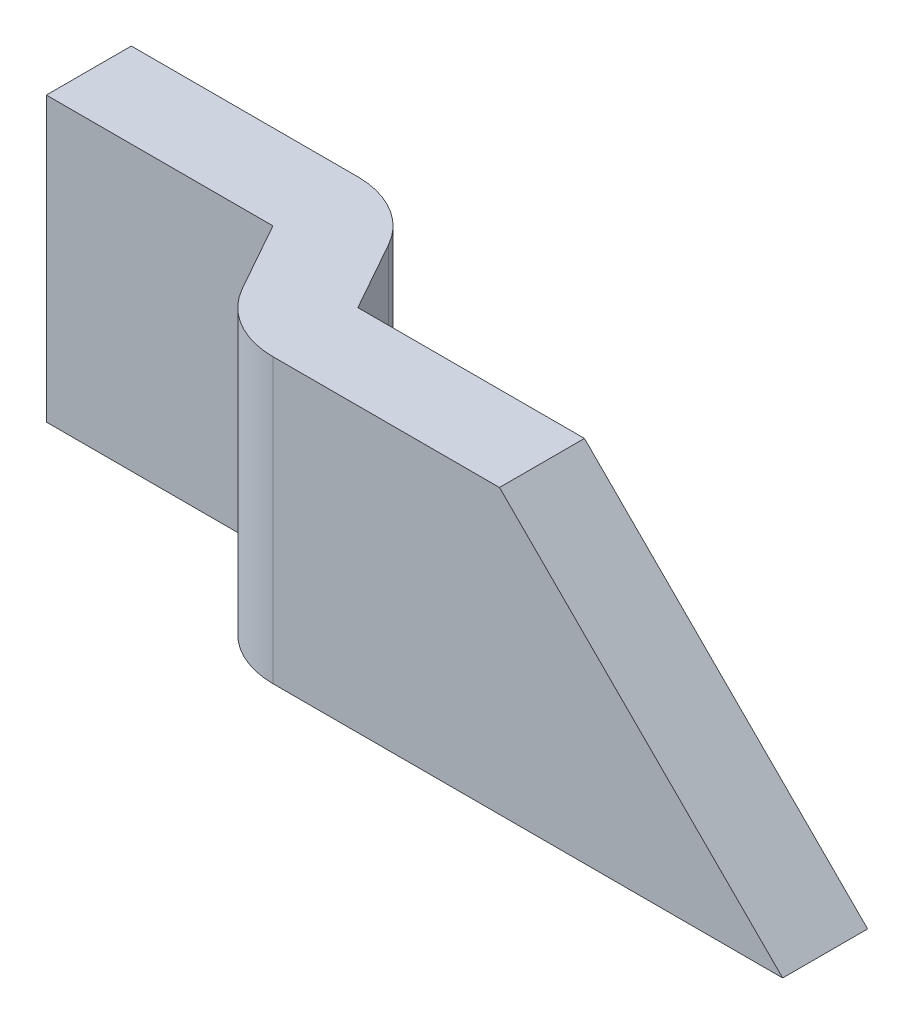
ISO-10303-21;
HEADER;
FILE_DESCRIPTION(('STEP AP214'),'2;1');
FILE_NAME('part.step','',(''),(''),'','','');
FILE_SCHEMA(('AUTOMOTIVE_DESIGN { 1 0 10303 214 1 1 1 1 }'));
ENDSEC;
DATA;
#1=APPLICATION_CONTEXT('core data for automotive mechanical design processes');
#2=APPLICATION_PROTOCOL_DEFINITION('international standard','automotive_design',2000,#1);
#3=PRODUCT_CONTEXT('',#1,'mechanical');
#4=PRODUCT('Part','Part','',(#3));
#5=PRODUCT_RELATED_PRODUCT_CATEGORY('part','',(#4));
#6=PRODUCT_DEFINITION_FORMATION('','',#4);
#7=PRODUCT_DEFINITION_CONTEXT('part definition',#1,'design');
#8=PRODUCT_DEFINITION('design','',#6,#7);
#9=PRODUCT_DEFINITION_SHAPE('','',#8);
#10=(LENGTH_UNIT() NAMED_UNIT(*) SI_UNIT(.MILLI.,.METRE.));
#11=(NAMED_UNIT(*) PLANE_ANGLE_UNIT() SI_UNIT($,.RADIAN.));
#12=(NAMED_UNIT(*) SI_UNIT($,.STERADIAN.) SOLID_ANGLE_UNIT());
#13=UNCERTAINTY_MEASURE_WITH_UNIT(LENGTH_MEASURE(1.E-05),#10,'distance_accuracy_value','');
#14=(GEOMETRIC_REPRESENTATION_CONTEXT(3) GLOBAL_UNCERTAINTY_ASSIGNED_CONTEXT((#13)) GLOBAL_UNIT_ASSIGNED_CONTEXT((#10,
#11,#12)) REPRESENTATION_CONTEXT('',''));
#15=CARTESIAN_POINT('',(0.,0.,0.));
#16=DIRECTION('',(0.,0.,1.));
#17=DIRECTION('',(1.,0.,0.));
#18=AXIS2_PLACEMENT_3D('',#15,#16,#17);
#19=CARTESIAN_POINT('',(-2.790803356264,-1.6004,-0.05));
#20=DIRECTION('',(0.,0.,1.));
#21=DIRECTION('',(1.,0.,0.));
#22=AXIS2_PLACEMENT_3D('',#19,#20,#21);
#23=PLANE('',#22);
#24=DIRECTION('',(-1.,0.,0.));
#25=VECTOR('',#24,1.);
#26=CARTESIAN_POINT('',(-2.80000000001,-1.60000000001,-0.05000000001));
#27=LINE('',#26,#25);
#28=CARTESIAN_POINT('',(-2.8,-1.6,-0.05));
#29=VERTEX_POINT('',#28);
#30=CARTESIAN_POINT('',(-3.2,-1.6,-0.05000000000001));
#31=VERTEX_POINT('',#30);
#32=EDGE_CURVE('E11',#29,#31,#27,.T.);
#33=ORIENTED_EDGE('',*,*,#32,.F.);
#34=DIRECTION('',(0.,-1.,0.));
#35=VECTOR('',#34,1.);
#36=CARTESIAN_POINT('',(-2.80000000001,-1.61000000001,-0.05000000001));
#37=LINE('',#36,#35);
#38=CARTESIAN_POINT('',(-2.8,-2.1,-0.05));
#39=VERTEX_POINT('',#38);
#40=EDGE_CURVE('E24',#29,#39,#37,.T.);
#41=ORIENTED_EDGE('',*,*,#40,.T.);
#42=DIRECTION('',(1.,0.,0.));
#43=VECTOR('',#42,1.);
#44=CARTESIAN_POINT('',(-3.20000000001,-2.10000000001,-0.05000000001001));
#45=LINE('',#44,#43);
#46=CARTESIAN_POINT('',(-3.2,-2.1,-0.05000000000001));
#47=VERTEX_POINT('',#46);
#48=EDGE_CURVE('E97',#47,#39,#45,.T.);
#49=ORIENTED_EDGE('',*,*,#48,.F.);
#50=DIRECTION('',(0.,-1.,0.));
#51=VECTOR('',#50,1.);
#52=CARTESIAN_POINT('',(-3.20000000001,-1.61000000001,-0.05000000001001));
#53=LINE('',#52,#51);
#54=EDGE_CURVE('E169',#31,#47,#53,.T.);
#55=ORIENTED_EDGE('',*,*,#54,.F.);
#56=EDGE_LOOP('',(#33,#41,#49,#55));
#57=FACE_BOUND('',#56,.T.);
#58=ADVANCED_FACE('F17',(#57),#23,.F.);
#59=CARTESIAN_POINT('',(-2.6,-1.600400000825,0.15));
#60=DIRECTION('',(0.,1.,0.));
#61=DIRECTION('',(0.,0.,-1.));
#62=AXIS2_PLACEMENT_3D('',#59,#60,#61);
#63=CYLINDRICAL_SURFACE('',#62,0.15);
#64=DIRECTION('',(0.,1.,0.));
#65=VECTOR('',#64,1.);
#66=CARTESIAN_POINT('',(-2.730839062876,-2.09000000001,0.2233562514706));
#67=LINE('',#66,#65);
#68=CARTESIAN_POINT('',(-2.730839062866,-2.1,0.2233562514606));
#69=VERTEX_POINT('',#68);
#70=CARTESIAN_POINT('',(-2.730839062866,-1.6,0.2233562514611));
#71=VERTEX_POINT('',#70);
#72=EDGE_CURVE('E167',#69,#71,#67,.T.);
#73=ORIENTED_EDGE('',*,*,#72,.F.);
#74=CARTESIAN_POINT('',(-2.60000000001,-2.10000000001,0.15000000001));
#75=DIRECTION('',(0.,1.,0.));
#76=DIRECTION('',(-0.872260419104394,0.,0.489041676407878));
#77=AXIS2_PLACEMENT_3D('',#74,#75,#76);
#78=CIRCLE('',#77,0.15);
#79=CARTESIAN_POINT('',(-2.6,-2.1,0.3));
#80=VERTEX_POINT('',#79);
#81=EDGE_CURVE('E165',#69,#80,#78,.T.);
#82=ORIENTED_EDGE('',*,*,#81,.T.);
#83=DIRECTION('',(0.,-1.,0.));
#84=VECTOR('',#83,1.);
#85=CARTESIAN_POINT('',(-2.60000000001,-1.61000000001,0.30000000001));
#86=LINE('',#85,#84);
#87=CARTESIAN_POINT('',(-2.6,-1.6,0.3));
#88=VERTEX_POINT('',#87);
#89=EDGE_CURVE('E162',#88,#80,#86,.T.);
#90=ORIENTED_EDGE('',*,*,#89,.F.);
#91=CARTESIAN_POINT('',(-2.60000000001,-1.60000000001,0.15000000001));
#92=DIRECTION('',(0.,-1.,0.));
#93=DIRECTION('',(0.,0.,1.));
#94=AXIS2_PLACEMENT_3D('',#91,#92,#93);
#95=CIRCLE('',#94,0.15);
#96=EDGE_CURVE('E159',#88,#71,#95,.T.);
#97=ORIENTED_EDGE('',*,*,#96,.T.);
#98=EDGE_LOOP('',(#73,#82,#90,#97));
#99=FACE_BOUND('',#98,.T.);
#100=ADVANCED_FACE('F209',(#99),#63,.T.);
#101=CARTESIAN_POINT('',(-3.209196643736,-1.6004,0.1));
#102=DIRECTION('',(0.,0.,-1.));
#103=DIRECTION('',(0.,-1.,0.));
#104=AXIS2_PLACEMENT_3D('',#101,#102,#103);
#105=PLANE('',#104);
#106=DIRECTION('',(0.,-1.,0.));
#107=VECTOR('',#106,1.);
#108=CARTESIAN_POINT('',(-3.20000000001,-1.61000000001,0.10000000001));
#109=LINE('',#108,#107);
#110=CARTESIAN_POINT('',(-3.2,-1.6,0.1));
#111=VERTEX_POINT('',#110);
#112=CARTESIAN_POINT('',(-3.2,-2.1,0.1));
#113=VERTEX_POINT('',#112);
#114=EDGE_CURVE('E157',#111,#113,#109,.T.);
#115=ORIENTED_EDGE('',*,*,#114,.T.);
#116=DIRECTION('',(-1.,0.,0.));
#117=VECTOR('',#116,1.);
#118=CARTESIAN_POINT('',(-2.80000000001,-2.10000000001,0.1000000000101));
#119=LINE('',#118,#117);
#120=CARTESIAN_POINT('',(-2.8,-2.1,0.1000000000001));
#121=VERTEX_POINT('',#120);
#122=EDGE_CURVE('E154',#121,#113,#119,.T.);
#123=ORIENTED_EDGE('',*,*,#122,.F.);
#124=DIRECTION('',(0.,-1.,0.));
#125=VECTOR('',#124,1.);
#126=CARTESIAN_POINT('',(-2.80000000001,-1.61000000001,0.1000000000101));
#127=LINE('',#126,#125);
#128=CARTESIAN_POINT('',(-2.8,-1.6,0.1000000000001));
#129=VERTEX_POINT('',#128);
#130=EDGE_CURVE('E151',#129,#121,#127,.T.);
#131=ORIENTED_EDGE('',*,*,#130,.F.);
#132=DIRECTION('',(1.,0.,0.));
#133=VECTOR('',#132,1.);
#134=CARTESIAN_POINT('',(-3.20000000001,-1.60000000001,0.10000000001));
#135=LINE('',#134,#133);
#136=EDGE_CURVE('E148',#111,#129,#135,.T.);
#137=ORIENTED_EDGE('',*,*,#136,.F.);
#138=EDGE_LOOP('',(#115,#123,#131,#137));
#139=FACE_BOUND('',#138,.T.);
#140=ADVANCED_FACE('F193',(#139),#105,.F.);
#141=CARTESIAN_POINT('',(-2.80449754207,-1.6004,0.09197813168083));
#142=DIRECTION('',(0.872260419103312,0.,-0.489041676409807));
#143=DIRECTION('',(0.,-1.,0.));
#144=AXIS2_PLACEMENT_3D('',#141,#142,#143);
#145=PLANE('',#144);
#146=DIRECTION('',(0.489041676433833,0.,0.872260419089842));
#147=VECTOR('',#146,1.);
#148=CARTESIAN_POINT('',(-2.80000000001,-2.10000000001,0.1000000000101));
#149=LINE('',#148,#147);
#150=EDGE_CURVE('E145',#121,#69,#149,.T.);
#151=ORIENTED_EDGE('',*,*,#150,.T.);
#152=ORIENTED_EDGE('',*,*,#72,.T.);
#153=DIRECTION('',(-0.489041676434027,0.,-0.872260419089733));
#154=VECTOR('',#153,1.);
#155=CARTESIAN_POINT('',(-2.730839062876,-1.60000000001,0.2233562514717));
#156=LINE('',#155,#154);
#157=EDGE_CURVE('E142',#71,#129,#156,.T.);
#158=ORIENTED_EDGE('',*,*,#157,.T.);
#159=ORIENTED_EDGE('',*,*,#130,.T.);
#160=EDGE_LOOP('',(#151,#152,#158,#159));
#161=FACE_BOUND('',#160,.T.);
#162=ADVANCED_FACE('F189',(#161),#145,.F.);
#163=CARTESIAN_POINT('',(3.328,-1.6,-0.05919664373562));
#164=DIRECTION('',(0.,1.,0.));
#165=DIRECTION('',(1.,0.,0.));
#166=AXIS2_PLACEMENT_3D('',#163,#164,#165);
#167=PLANE('',#166);
#168=DIRECTION('',(-1.,0.,0.));
#169=VECTOR('',#168,1.);
#170=CARTESIAN_POINT('',(-2.19000000001,-1.60000000001,0.15000000001));
#171=LINE('',#170,#169);
#172=CARTESIAN_POINT('',(-2.20000000002,-1.6,0.15000000001));
#173=VERTEX_POINT('',#172);
#174=CARTESIAN_POINT('',(-2.6,-1.6,0.15));
#175=VERTEX_POINT('',#174);
#176=EDGE_CURVE('E140',#173,#175,#171,.T.);
#177=ORIENTED_EDGE('',*,*,#176,.T.);
#178=DIRECTION('',(0.489041676434222,0.,0.872260419089623));
#179=VECTOR('',#178,1.);
#180=CARTESIAN_POINT('',(-2.669160937145,-1.60000000001,0.02664374854807));
#181=LINE('',#180,#179);
#182=CARTESIAN_POINT('',(-2.669160937135,-1.6,0.02664374853807));
#183=VERTEX_POINT('',#182);
#184=EDGE_CURVE('E138',#183,#175,#181,.T.);
#185=ORIENTED_EDGE('',*,*,#184,.F.);
#186=CARTESIAN_POINT('',(-2.80000000001,-1.60000000001,0.10000000001));
#187=DIRECTION('',(0.,-1.,0.));
#188=DIRECTION('',(0.,0.,-1.));
#189=AXIS2_PLACEMENT_3D('',#186,#187,#188);
#190=CIRCLE('',#189,0.15);
#191=EDGE_CURVE('E112',#29,#183,#190,.T.);
#192=ORIENTED_EDGE('',*,*,#191,.F.);
#193=ORIENTED_EDGE('',*,*,#32,.T.);
#194=DIRECTION('',(0.,0.,1.));
#195=VECTOR('',#194,1.);
#196=CARTESIAN_POINT('',(-3.20000000001,-1.60000000001,-0.05000000001001));
#197=LINE('',#196,#195);
#198=EDGE_CURVE('E135',#31,#111,#197,.T.);
#199=ORIENTED_EDGE('',*,*,#198,.T.);
#200=ORIENTED_EDGE('',*,*,#136,.T.);
#201=ORIENTED_EDGE('',*,*,#157,.F.);
#202=ORIENTED_EDGE('',*,*,#96,.F.);
#203=DIRECTION('',(-1.,0.,0.));
#204=VECTOR('',#203,1.);
#205=CARTESIAN_POINT('',(-2.19000000001,-1.60000000001,0.30000000001));
#206=LINE('',#205,#204);
#207=CARTESIAN_POINT('',(-2.19999999999,-1.60000000001,0.30000000001));
#208=VERTEX_POINT('',#207);
#209=EDGE_CURVE('E132',#208,#88,#206,.T.);
#210=ORIENTED_EDGE('',*,*,#209,.F.);
#211=DIRECTION('',(0.,0.,1.));
#212=VECTOR('',#211,1.);
#213=CARTESIAN_POINT('',(-2.2,-1.6,-0.03659832186781));
#214=LINE('',#213,#212);
#215=EDGE_CURVE('E129',#173,#208,#214,.T.);
#216=ORIENTED_EDGE('',*,*,#215,.F.);
#217=EDGE_LOOP('',(#177,#185,#192,#193,#199,#200,#201,#202,#210,#216));
#218=FACE_BOUND('',#217,.T.);
#219=ADVANCED_FACE('F172',(#218),#167,.T.);
#220=CARTESIAN_POINT('',(-2.704,-2.1736,0.3));
#221=DIRECTION('',(0.,0.,1.));
#222=DIRECTION('',(1.,0.,0.));
#223=AXIS2_PLACEMENT_3D('',#220,#221,#222);
#224=PLANE('',#223);
#225=ORIENTED_EDGE('',*,*,#209,.T.);
#226=ORIENTED_EDGE('',*,*,#89,.T.);
#227=DIRECTION('',(1.,0.,0.));
#228=VECTOR('',#227,1.);
#229=CARTESIAN_POINT('',(-2.60000000001,-2.10000000001,0.30000000001));
#230=LINE('',#229,#228);
#231=CARTESIAN_POINT('',(-1.69999999999,-2.10000000001,0.30000000001));
#232=VERTEX_POINT('',#231);
#233=EDGE_CURVE('E127',#80,#232,#230,.T.);
#234=ORIENTED_EDGE('',*,*,#233,.T.);
#235=DIRECTION('',(0.707106781186548,-0.707106781186548,0.));
#236=VECTOR('',#235,1.);
#237=CARTESIAN_POINT('',(-2.19000000001,-1.61000000001,0.30000000001));
#238=LINE('',#237,#236);
#239=EDGE_CURVE('E124',#208,#232,#238,.T.);
#240=ORIENTED_EDGE('',*,*,#239,.F.);
#241=EDGE_LOOP('',(#225,#226,#234,#240));
#242=FACE_BOUND('',#241,.T.);
#243=ADVANCED_FACE('F184',(#242),#224,.T.);
#244=CARTESIAN_POINT('',(-3.328,-2.1,-0.05919664373562));
#245=DIRECTION('',(0.,-1.,0.));
#246=DIRECTION('',(0.,0.,-1.));
#247=AXIS2_PLACEMENT_3D('',#244,#245,#246);
#248=PLANE('',#247);
#249=DIRECTION('',(1.,0.,0.));
#250=VECTOR('',#249,1.);
#251=CARTESIAN_POINT('',(-2.60000000001,-2.10000000001,0.15000000001));
#252=LINE('',#251,#250);
#253=CARTESIAN_POINT('',(-2.6,-2.1,0.15));
#254=VERTEX_POINT('',#253);
#255=CARTESIAN_POINT('',(-1.69999999999,-2.10000000001,0.15000000001));
#256=VERTEX_POINT('',#255);
#257=EDGE_CURVE('E122',#254,#256,#252,.T.);
#258=ORIENTED_EDGE('',*,*,#257,.T.);
#259=DIRECTION('',(0.,0.,-1.));
#260=VECTOR('',#259,1.);
#261=CARTESIAN_POINT('',(-1.7,-2.1,-0.03659832186781));
#262=LINE('',#261,#260);
#263=EDGE_CURVE('E119',#232,#256,#262,.T.);
#264=ORIENTED_EDGE('',*,*,#263,.F.);
#265=ORIENTED_EDGE('',*,*,#233,.F.);
#266=ORIENTED_EDGE('',*,*,#81,.F.);
#267=ORIENTED_EDGE('',*,*,#150,.F.);
#268=ORIENTED_EDGE('',*,*,#122,.T.);
#269=DIRECTION('',(0.,0.,-1.));
#270=VECTOR('',#269,1.);
#271=CARTESIAN_POINT('',(-3.20000000001,-2.10000000001,0.10000000001));
#272=LINE('',#271,#270);
#273=EDGE_CURVE('E100',#113,#47,#272,.T.);
#274=ORIENTED_EDGE('',*,*,#273,.T.);
#275=ORIENTED_EDGE('',*,*,#48,.T.);
#276=CARTESIAN_POINT('',(-2.80000000001,-2.10000000001,0.10000000001));
#277=DIRECTION('',(0.,1.,0.));
#278=DIRECTION('',(0.87226041910332,0.,-0.489041676409793));
#279=AXIS2_PLACEMENT_3D('',#276,#277,#278);
#280=CIRCLE('',#279,0.15);
#281=CARTESIAN_POINT('',(-2.669160937134,-2.1,0.02664374853933));
#282=VERTEX_POINT('',#281);
#283=EDGE_CURVE('E91',#282,#39,#280,.T.);
#284=ORIENTED_EDGE('',*,*,#283,.F.);
#285=DIRECTION('',(-0.489041676434028,0.,-0.872260419089733));
#286=VECTOR('',#285,1.);
#287=CARTESIAN_POINT('',(-2.60000000001,-2.10000000001,0.15000000001));
#288=LINE('',#287,#286);
#289=EDGE_CURVE('E94',#254,#282,#288,.T.);
#290=ORIENTED_EDGE('',*,*,#289,.F.);
#291=EDGE_LOOP('',(#258,#264,#265,#266,#267,#268,#274,#275,#284,#290));
#292=FACE_BOUND('',#291,.T.);
#293=ADVANCED_FACE('F93',(#292),#248,.T.);
#294=CARTESIAN_POINT('',(-2.59550245793,-1.6004,0.1580218683192));
#295=DIRECTION('',(-0.872260419103379,0.,0.489041676409688));
#296=DIRECTION('',(0.,1.,0.));
#297=AXIS2_PLACEMENT_3D('',#294,#295,#296);
#298=PLANE('',#297);
#299=ORIENTED_EDGE('',*,*,#289,.T.);
#300=DIRECTION('',(0.,1.,0.));
#301=VECTOR('',#300,1.);
#302=CARTESIAN_POINT('',(-2.669160937144,-2.09000000001,0.02664374854933));
#303=LINE('',#302,#301);
#304=EDGE_CURVE('E106',#282,#183,#303,.T.);
#305=ORIENTED_EDGE('',*,*,#304,.T.);
#306=ORIENTED_EDGE('',*,*,#184,.T.);
#307=DIRECTION('',(0.,-1.,0.));
#308=VECTOR('',#307,1.);
#309=CARTESIAN_POINT('',(-2.60000000001,-1.61000000001,0.15000000001));
#310=LINE('',#309,#308);
#311=EDGE_CURVE('E108',#175,#254,#310,.T.);
#312=ORIENTED_EDGE('',*,*,#311,.T.);
#313=EDGE_LOOP('',(#299,#305,#306,#312));
#314=FACE_BOUND('',#313,.T.);
#315=ADVANCED_FACE('F104',(#314),#298,.F.);
#316=CARTESIAN_POINT('',(-2.704,-2.1736,0.15));
#317=DIRECTION('',(0.,0.,1.));
#318=DIRECTION('',(1.,0.,0.));
#319=AXIS2_PLACEMENT_3D('',#316,#317,#318);
#320=PLANE('',#319);
#321=ORIENTED_EDGE('',*,*,#257,.F.);
#322=ORIENTED_EDGE('',*,*,#311,.F.);
#323=ORIENTED_EDGE('',*,*,#176,.F.);
#324=DIRECTION('',(-0.707106781186548,0.707106781186548,0.));
#325=VECTOR('',#324,1.);
#326=CARTESIAN_POINT('',(-1.71000000001,-2.09000000001,0.15000000001));
#327=LINE('',#326,#325);
#328=EDGE_CURVE('E114',#256,#173,#327,.T.);
#329=ORIENTED_EDGE('',*,*,#328,.F.);
#330=EDGE_LOOP('',(#321,#322,#323,#329));
#331=FACE_BOUND('',#330,.T.);
#332=ADVANCED_FACE('F175',(#331),#320,.F.);
#333=CARTESIAN_POINT('',(-3.2,-1.6004,-0.05919664373562));
#334=DIRECTION('',(1.,0.,0.));
#335=DIRECTION('',(0.,1.,0.));
#336=AXIS2_PLACEMENT_3D('',#333,#334,#335);
#337=PLANE('',#336);
#338=ORIENTED_EDGE('',*,*,#54,.T.);
#339=ORIENTED_EDGE('',*,*,#273,.F.);
#340=ORIENTED_EDGE('',*,*,#114,.F.);
#341=ORIENTED_EDGE('',*,*,#198,.F.);
#342=EDGE_LOOP('',(#338,#339,#340,#341));
#343=FACE_BOUND('',#342,.T.);
#344=ADVANCED_FACE('F197',(#343),#337,.F.);
#345=CARTESIAN_POINT('',(-2.8,-1.600400000825,0.1));
#346=DIRECTION('',(0.,1.,0.));
#347=DIRECTION('',(0.,0.,-1.));
#348=AXIS2_PLACEMENT_3D('',#345,#346,#347);
#349=CYLINDRICAL_SURFACE('',#348,0.15);
#350=ORIENTED_EDGE('',*,*,#304,.F.);
#351=ORIENTED_EDGE('',*,*,#283,.T.);
#352=ORIENTED_EDGE('',*,*,#40,.F.);
#353=ORIENTED_EDGE('',*,*,#191,.T.);
#354=EDGE_LOOP('',(#350,#351,#352,#353));
#355=FACE_BOUND('',#354,.T.);
#356=ADVANCED_FACE('F111',(#355),#349,.T.);
#357=CARTESIAN_POINT('',(-1.69999999999,-2.10000000001,0.3));
#358=DIRECTION('',(0.707106781186548,0.707106781186548,0.));
#359=DIRECTION('',(-0.707106781186548,0.707106781186548,0.));
#360=AXIS2_PLACEMENT_3D('',#357,#358,#359);
#361=PLANE('',#360);
#362=ORIENTED_EDGE('',*,*,#328,.T.);
#363=ORIENTED_EDGE('',*,*,#215,.T.);
#364=ORIENTED_EDGE('',*,*,#239,.T.);
#365=ORIENTED_EDGE('',*,*,#263,.T.);
#366=EDGE_LOOP('',(#362,#363,#364,#365));
#367=FACE_BOUND('',#366,.T.);
#368=ADVANCED_FACE('F181',(#367),#361,.T.);
#369=CLOSED_SHELL('',(#58,#100,#140,#162,#219,#243,#293,#315,#332,#344,#356,#368));
#370=MANIFOLD_SOLID_BREP('B1',#369);
#371=ADVANCED_BREP_SHAPE_REPRESENTATION('',(#18,#370),#14);
#372=SHAPE_DEFINITION_REPRESENTATION(#9,#371);
ENDSEC;
END-ISO-10303-21;
